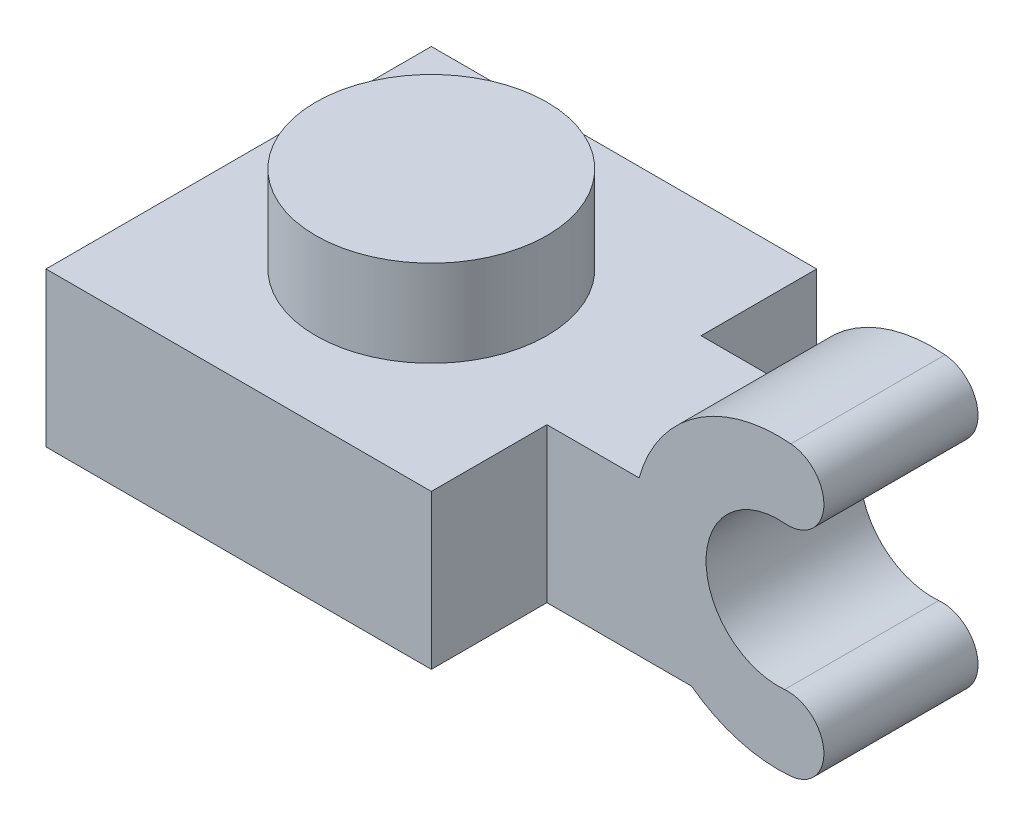
ISO-10303-21;
HEADER;
FILE_DESCRIPTION(('STEP AP214'),'2;1');
FILE_NAME('part.step','',(''),(''),'','','');
FILE_SCHEMA(('AUTOMOTIVE_DESIGN { 1 0 10303 214 1 1 1 1 }'));
ENDSEC;
DATA;
#1=APPLICATION_CONTEXT('core data for automotive mechanical design processes');
#2=APPLICATION_PROTOCOL_DEFINITION('international standard','automotive_design',2000,#1);
#3=PRODUCT_CONTEXT('',#1,'mechanical');
#4=PRODUCT('Part','Part','',(#3));
#5=PRODUCT_RELATED_PRODUCT_CATEGORY('part','',(#4));
#6=PRODUCT_DEFINITION_FORMATION('','',#4);
#7=PRODUCT_DEFINITION_CONTEXT('part definition',#1,'design');
#8=PRODUCT_DEFINITION('design','',#6,#7);
#9=PRODUCT_DEFINITION_SHAPE('','',#8);
#10=(LENGTH_UNIT() NAMED_UNIT(*) SI_UNIT(.MILLI.,.METRE.));
#11=(NAMED_UNIT(*) PLANE_ANGLE_UNIT() SI_UNIT($,.RADIAN.));
#12=(NAMED_UNIT(*) SI_UNIT($,.STERADIAN.) SOLID_ANGLE_UNIT());
#13=UNCERTAINTY_MEASURE_WITH_UNIT(LENGTH_MEASURE(1.E-05),#10,'distance_accuracy_value','');
#14=(GEOMETRIC_REPRESENTATION_CONTEXT(3) GLOBAL_UNCERTAINTY_ASSIGNED_CONTEXT((#13)) GLOBAL_UNIT_ASSIGNED_CONTEXT((#10,
#11,#12)) REPRESENTATION_CONTEXT('',''));
#15=CARTESIAN_POINT('',(0.,0.,0.));
#16=DIRECTION('',(0.,0.,1.));
#17=DIRECTION('',(1.,0.,0.));
#18=AXIS2_PLACEMENT_3D('',#15,#16,#17);
#19=CARTESIAN_POINT('',(8.,3.2,0.));
#20=DIRECTION('',(-1.,0.,0.));
#21=DIRECTION('',(0.,0.,1.));
#22=AXIS2_PLACEMENT_3D('',#19,#20,#21);
#23=PLANE('',#22);
#24=DIRECTION('',(0.,1.,0.));
#25=VECTOR('',#24,1.);
#26=CARTESIAN_POINT('',(8.,3.2,-5.6));
#27=LINE('',#26,#25);
#28=CARTESIAN_POINT('',(8.,0.,-5.6));
#29=VERTEX_POINT('',#28);
#30=CARTESIAN_POINT('',(8.,3.2,-5.6));
#31=VERTEX_POINT('',#30);
#32=EDGE_CURVE('E198',#29,#31,#27,.T.);
#33=ORIENTED_EDGE('',*,*,#32,.F.);
#34=DIRECTION('',(0.,0.,-1.));
#35=VECTOR('',#34,1.);
#36=CARTESIAN_POINT('',(8.,0.,0.));
#37=LINE('',#36,#35);
#38=CARTESIAN_POINT('',(8.,0.,-8.));
#39=VERTEX_POINT('',#38);
#40=EDGE_CURVE('E315',#29,#39,#37,.T.);
#41=ORIENTED_EDGE('',*,*,#40,.T.);
#42=DIRECTION('',(0.,-1.,0.));
#43=VECTOR('',#42,1.);
#44=CARTESIAN_POINT('',(8.,3.2,-8.));
#45=LINE('',#44,#43);
#46=CARTESIAN_POINT('',(8.,3.2,-8.));
#47=VERTEX_POINT('',#46);
#48=EDGE_CURVE('E325',#47,#39,#45,.T.);
#49=ORIENTED_EDGE('',*,*,#48,.F.);
#50=DIRECTION('',(0.,0.,-1.));
#51=VECTOR('',#50,1.);
#52=CARTESIAN_POINT('',(8.,3.2,0.));
#53=LINE('',#52,#51);
#54=EDGE_CURVE('E300',#31,#47,#53,.T.);
#55=ORIENTED_EDGE('',*,*,#54,.F.);
#56=EDGE_LOOP('',(#33,#41,#49,#55));
#57=FACE_BOUND('',#56,.T.);
#58=ADVANCED_FACE('F42',(#57),#23,.F.);
#59=CARTESIAN_POINT('',(0.,3.2,0.));
#60=DIRECTION('',(1.,0.,0.));
#61=DIRECTION('',(0.,0.,-1.));
#62=AXIS2_PLACEMENT_3D('',#59,#60,#61);
#63=PLANE('',#62);
#64=DIRECTION('',(0.,0.,1.));
#65=VECTOR('',#64,1.);
#66=CARTESIAN_POINT('',(0.,0.,0.));
#67=LINE('',#66,#65);
#68=CARTESIAN_POINT('',(0.,0.,-8.));
#69=VERTEX_POINT('',#68);
#70=CARTESIAN_POINT('',(0.,0.,0.));
#71=VERTEX_POINT('',#70);
#72=EDGE_CURVE('E290',#69,#71,#67,.T.);
#73=ORIENTED_EDGE('',*,*,#72,.T.);
#74=DIRECTION('',(0.,-1.,0.));
#75=VECTOR('',#74,1.);
#76=CARTESIAN_POINT('',(0.,3.2,0.));
#77=LINE('',#76,#75);
#78=CARTESIAN_POINT('',(0.,3.2,0.));
#79=VERTEX_POINT('',#78);
#80=EDGE_CURVE('E46',#79,#71,#77,.T.);
#81=ORIENTED_EDGE('',*,*,#80,.F.);
#82=DIRECTION('',(0.,0.,1.));
#83=VECTOR('',#82,1.);
#84=CARTESIAN_POINT('',(0.,3.2,0.));
#85=LINE('',#84,#83);
#86=CARTESIAN_POINT('',(0.,3.2,-8.));
#87=VERTEX_POINT('',#86);
#88=EDGE_CURVE('E292',#87,#79,#85,.T.);
#89=ORIENTED_EDGE('',*,*,#88,.F.);
#90=DIRECTION('',(0.,-1.,0.));
#91=VECTOR('',#90,1.);
#92=CARTESIAN_POINT('',(0.,3.2,-8.));
#93=LINE('',#92,#91);
#94=EDGE_CURVE('E308',#87,#69,#93,.T.);
#95=ORIENTED_EDGE('',*,*,#94,.T.);
#96=EDGE_LOOP('',(#73,#81,#89,#95));
#97=FACE_BOUND('',#96,.T.);
#98=ADVANCED_FACE('F44',(#97),#63,.F.);
#99=CARTESIAN_POINT('',(0.,3.2,0.));
#100=DIRECTION('',(0.,0.,-1.));
#101=DIRECTION('',(-1.,0.,0.));
#102=AXIS2_PLACEMENT_3D('',#99,#100,#101);
#103=PLANE('',#102);
#104=DIRECTION('',(1.,0.,0.));
#105=VECTOR('',#104,1.);
#106=CARTESIAN_POINT('',(0.,0.,0.));
#107=LINE('',#106,#105);
#108=CARTESIAN_POINT('',(8.,0.,0.));
#109=VERTEX_POINT('',#108);
#110=EDGE_CURVE('E312',#71,#109,#107,.T.);
#111=ORIENTED_EDGE('',*,*,#110,.T.);
#112=DIRECTION('',(0.,-1.,0.));
#113=VECTOR('',#112,1.);
#114=CARTESIAN_POINT('',(8.,3.2,0.));
#115=LINE('',#114,#113);
#116=CARTESIAN_POINT('',(8.,3.2,0.));
#117=VERTEX_POINT('',#116);
#118=EDGE_CURVE('E328',#117,#109,#115,.T.);
#119=ORIENTED_EDGE('',*,*,#118,.F.);
#120=DIRECTION('',(1.,0.,0.));
#121=VECTOR('',#120,1.);
#122=CARTESIAN_POINT('',(0.,3.2,0.));
#123=LINE('',#122,#121);
#124=EDGE_CURVE('E296',#79,#117,#123,.T.);
#125=ORIENTED_EDGE('',*,*,#124,.F.);
#126=ORIENTED_EDGE('',*,*,#80,.T.);
#127=EDGE_LOOP('',(#111,#119,#125,#126));
#128=FACE_BOUND('',#127,.T.);
#129=ADVANCED_FACE('F339',(#128),#103,.F.);
#130=CARTESIAN_POINT('',(8.,0.,-2.4));
#131=VERTEX_POINT('',#130);
#132=EDGE_CURVE('E316',#109,#131,#37,.T.);
#133=ORIENTED_EDGE('',*,*,#132,.T.);
#134=DIRECTION('',(0.,1.,0.));
#135=VECTOR('',#134,1.);
#136=CARTESIAN_POINT('',(8.,3.2,-2.4));
#137=LINE('',#136,#135);
#138=CARTESIAN_POINT('',(8.,3.2,-2.4));
#139=VERTEX_POINT('',#138);
#140=EDGE_CURVE('E223',#131,#139,#137,.T.);
#141=ORIENTED_EDGE('',*,*,#140,.T.);
#142=EDGE_CURVE('E301',#117,#139,#53,.T.);
#143=ORIENTED_EDGE('',*,*,#142,.F.);
#144=ORIENTED_EDGE('',*,*,#118,.T.);
#145=EDGE_LOOP('',(#133,#141,#143,#144));
#146=FACE_BOUND('',#145,.T.);
#147=ADVANCED_FACE('F349',(#146),#23,.F.);
#148=CARTESIAN_POINT('',(0.,3.2,-8.));
#149=DIRECTION('',(0.,0.,1.));
#150=DIRECTION('',(1.,0.,0.));
#151=AXIS2_PLACEMENT_3D('',#148,#149,#150);
#152=PLANE('',#151);
#153=DIRECTION('',(-1.,0.,0.));
#154=VECTOR('',#153,1.);
#155=CARTESIAN_POINT('',(0.,0.,-8.));
#156=LINE('',#155,#154);
#157=EDGE_CURVE('E297',#39,#69,#156,.T.);
#158=ORIENTED_EDGE('',*,*,#157,.T.);
#159=ORIENTED_EDGE('',*,*,#94,.F.);
#160=DIRECTION('',(-1.,0.,0.));
#161=VECTOR('',#160,1.);
#162=CARTESIAN_POINT('',(0.,3.2,-8.));
#163=LINE('',#162,#161);
#164=EDGE_CURVE('E305',#47,#87,#163,.T.);
#165=ORIENTED_EDGE('',*,*,#164,.F.);
#166=ORIENTED_EDGE('',*,*,#48,.T.);
#167=EDGE_LOOP('',(#158,#159,#165,#166));
#168=FACE_BOUND('',#167,.T.);
#169=ADVANCED_FACE('F357',(#168),#152,.F.);
#170=CARTESIAN_POINT('',(0.,3.2,0.));
#171=DIRECTION('',(0.,-1.,0.));
#172=DIRECTION('',(0.,0.,-1.));
#173=AXIS2_PLACEMENT_3D('',#170,#171,#172);
#174=PLANE('',#173);
#175=CARTESIAN_POINT('',(4.,3.2,-4.));
#176=DIRECTION('',(0.,1.,0.));
#177=DIRECTION('',(0.,0.,1.));
#178=AXIS2_PLACEMENT_3D('',#175,#176,#177);
#179=CIRCLE('',#178,2.4);
#180=CARTESIAN_POINT('',(4.,3.2,-1.6));
#181=VERTEX_POINT('',#180);
#182=EDGE_CURVE('E11',#181,#181,#179,.T.);
#183=ORIENTED_EDGE('',*,*,#182,.F.);
#184=EDGE_LOOP('',(#183));
#185=FACE_BOUND('',#184,.T.);
#186=ORIENTED_EDGE('',*,*,#88,.T.);
#187=ORIENTED_EDGE('',*,*,#124,.T.);
#188=ORIENTED_EDGE('',*,*,#142,.T.);
#189=DIRECTION('',(1.,0.,0.));
#190=VECTOR('',#189,1.);
#191=CARTESIAN_POINT('',(8.,3.2,-2.4));
#192=LINE('',#191,#190);
#193=CARTESIAN_POINT('',(9.91253311985758,3.2,-2.4));
#194=VERTEX_POINT('',#193);
#195=EDGE_CURVE('E59',#139,#194,#192,.T.);
#196=ORIENTED_EDGE('',*,*,#195,.T.);
#197=DIRECTION('',(0.,0.,-1.));
#198=VECTOR('',#197,1.);
#199=CARTESIAN_POINT('',(9.91253311985758,3.2,-2.4));
#200=LINE('',#199,#198);
#201=CARTESIAN_POINT('',(9.91253311985758,3.2,-5.6));
#202=VERTEX_POINT('',#201);
#203=EDGE_CURVE('E234',#194,#202,#200,.T.);
#204=ORIENTED_EDGE('',*,*,#203,.T.);
#205=DIRECTION('',(1.,0.,0.));
#206=VECTOR('',#205,1.);
#207=CARTESIAN_POINT('',(8.,3.2,-5.6));
#208=LINE('',#207,#206);
#209=EDGE_CURVE('E201',#31,#202,#208,.T.);
#210=ORIENTED_EDGE('',*,*,#209,.F.);
#211=ORIENTED_EDGE('',*,*,#54,.T.);
#212=ORIENTED_EDGE('',*,*,#164,.T.);
#213=EDGE_LOOP('',(#186,#187,#188,#196,#204,#210,#211,#212));
#214=FACE_BOUND('',#213,.T.);
#215=ADVANCED_FACE('F351',(#185,#214),#174,.F.);
#216=CARTESIAN_POINT('',(0.,0.,0.));
#217=DIRECTION('',(0.,-1.,0.));
#218=DIRECTION('',(0.,0.,-1.));
#219=AXIS2_PLACEMENT_3D('',#216,#217,#218);
#220=PLANE('',#219);
#221=DIRECTION('',(0.,0.,-1.));
#222=VECTOR('',#221,1.);
#223=CARTESIAN_POINT('',(1.6,0.,-1.6));
#224=LINE('',#223,#222);
#225=CARTESIAN_POINT('',(1.6,0.,-1.6));
#226=VERTEX_POINT('',#225);
#227=CARTESIAN_POINT('',(1.6,0.,-6.4));
#228=VERTEX_POINT('',#227);
#229=EDGE_CURVE('E67',#226,#228,#224,.T.);
#230=ORIENTED_EDGE('',*,*,#229,.F.);
#231=DIRECTION('',(-1.,0.,0.));
#232=VECTOR('',#231,1.);
#233=CARTESIAN_POINT('',(1.6,0.,-1.6));
#234=LINE('',#233,#232);
#235=CARTESIAN_POINT('',(6.4,0.,-1.6));
#236=VERTEX_POINT('',#235);
#237=EDGE_CURVE('E250',#236,#226,#234,.T.);
#238=ORIENTED_EDGE('',*,*,#237,.F.);
#239=DIRECTION('',(0.,0.,1.));
#240=VECTOR('',#239,1.);
#241=CARTESIAN_POINT('',(6.4,0.,-1.6));
#242=LINE('',#241,#240);
#243=CARTESIAN_POINT('',(6.4,0.,-6.4));
#244=VERTEX_POINT('',#243);
#245=EDGE_CURVE('E269',#244,#236,#242,.T.);
#246=ORIENTED_EDGE('',*,*,#245,.F.);
#247=DIRECTION('',(1.,0.,0.));
#248=VECTOR('',#247,1.);
#249=CARTESIAN_POINT('',(1.6,0.,-6.4));
#250=LINE('',#249,#248);
#251=EDGE_CURVE('E265',#228,#244,#250,.T.);
#252=ORIENTED_EDGE('',*,*,#251,.F.);
#253=EDGE_LOOP('',(#230,#238,#246,#252));
#254=FACE_BOUND('',#253,.T.);
#255=ORIENTED_EDGE('',*,*,#72,.F.);
#256=ORIENTED_EDGE('',*,*,#157,.F.);
#257=ORIENTED_EDGE('',*,*,#40,.F.);
#258=DIRECTION('',(-1.,0.,0.));
#259=VECTOR('',#258,1.);
#260=CARTESIAN_POINT('',(8.,0.,-5.6));
#261=LINE('',#260,#259);
#262=CARTESIAN_POINT('',(11.0038995788178,0.,-5.6));
#263=VERTEX_POINT('',#262);
#264=EDGE_CURVE('E195',#263,#29,#261,.T.);
#265=ORIENTED_EDGE('',*,*,#264,.F.);
#266=DIRECTION('',(0.,0.,-1.));
#267=VECTOR('',#266,1.);
#268=CARTESIAN_POINT('',(11.0038995788178,0.,-2.4));
#269=LINE('',#268,#267);
#270=CARTESIAN_POINT('',(11.0038995788178,0.,-2.4));
#271=VERTEX_POINT('',#270);
#272=EDGE_CURVE('E237',#271,#263,#269,.T.);
#273=ORIENTED_EDGE('',*,*,#272,.F.);
#274=DIRECTION('',(-1.,0.,0.));
#275=VECTOR('',#274,1.);
#276=CARTESIAN_POINT('',(8.,0.,-2.4));
#277=LINE('',#276,#275);
#278=EDGE_CURVE('E219',#271,#131,#277,.T.);
#279=ORIENTED_EDGE('',*,*,#278,.T.);
#280=ORIENTED_EDGE('',*,*,#132,.F.);
#281=ORIENTED_EDGE('',*,*,#110,.F.);
#282=EDGE_LOOP('',(#255,#256,#257,#265,#273,#279,#280,#281));
#283=FACE_BOUND('',#282,.T.);
#284=ADVANCED_FACE('F346',(#254,#283),#220,.T.);
#285=CARTESIAN_POINT('',(4.,5.,-4.));
#286=DIRECTION('',(0.,-1.,0.));
#287=DIRECTION('',(0.,0.,-1.));
#288=AXIS2_PLACEMENT_3D('',#285,#286,#287);
#289=CYLINDRICAL_SURFACE('',#288,2.4);
#290=CARTESIAN_POINT('',(4.,5.,-4.));
#291=DIRECTION('',(0.,1.,0.));
#292=DIRECTION('',(0.,0.,1.));
#293=AXIS2_PLACEMENT_3D('',#290,#291,#292);
#294=CIRCLE('',#293,2.4);
#295=CARTESIAN_POINT('',(4.,5.,-1.6));
#296=VERTEX_POINT('',#295);
#297=EDGE_CURVE('E279',#296,#296,#294,.T.);
#298=ORIENTED_EDGE('',*,*,#297,.F.);
#299=EDGE_LOOP('',(#298));
#300=FACE_BOUND('',#299,.T.);
#301=ORIENTED_EDGE('',*,*,#182,.T.);
#302=EDGE_LOOP('',(#301));
#303=FACE_BOUND('',#302,.T.);
#304=ADVANCED_FACE('F441',(#300,#303),#289,.T.);
#305=CARTESIAN_POINT('',(4.,5.,-4.));
#306=DIRECTION('',(0.,1.,0.));
#307=DIRECTION('',(0.,0.,1.));
#308=AXIS2_PLACEMENT_3D('',#305,#306,#307);
#309=PLANE('',#308);
#310=ORIENTED_EDGE('',*,*,#297,.T.);
#311=EDGE_LOOP('',(#310));
#312=FACE_BOUND('',#311,.T.);
#313=ADVANCED_FACE('F454',(#312),#309,.T.);
#314=CARTESIAN_POINT('',(1.6,1.8,-1.6));
#315=DIRECTION('',(-1.,0.,0.));
#316=DIRECTION('',(0.,0.,1.));
#317=AXIS2_PLACEMENT_3D('',#314,#315,#316);
#318=PLANE('',#317);
#319=ORIENTED_EDGE('',*,*,#229,.T.);
#320=DIRECTION('',(0.,-1.,0.));
#321=VECTOR('',#320,1.);
#322=CARTESIAN_POINT('',(1.6,1.8,-6.4));
#323=LINE('',#322,#321);
#324=CARTESIAN_POINT('',(1.6,1.8,-6.4));
#325=VERTEX_POINT('',#324);
#326=EDGE_CURVE('E262',#325,#228,#323,.T.);
#327=ORIENTED_EDGE('',*,*,#326,.F.);
#328=DIRECTION('',(0.,0.,-1.));
#329=VECTOR('',#328,1.);
#330=CARTESIAN_POINT('',(1.6,1.8,-1.6));
#331=LINE('',#330,#329);
#332=CARTESIAN_POINT('',(1.6,1.8,-1.6));
#333=VERTEX_POINT('',#332);
#334=EDGE_CURVE('E245',#333,#325,#331,.T.);
#335=ORIENTED_EDGE('',*,*,#334,.F.);
#336=DIRECTION('',(0.,-1.,0.));
#337=VECTOR('',#336,1.);
#338=CARTESIAN_POINT('',(1.6,1.8,-1.6));
#339=LINE('',#338,#337);
#340=EDGE_CURVE('E276',#333,#226,#339,.T.);
#341=ORIENTED_EDGE('',*,*,#340,.T.);
#342=EDGE_LOOP('',(#319,#327,#335,#341));
#343=FACE_BOUND('',#342,.T.);
#344=ADVANCED_FACE('F465',(#343),#318,.F.);
#345=CARTESIAN_POINT('',(1.6,1.8,-1.6));
#346=DIRECTION('',(0.,0.,1.));
#347=DIRECTION('',(1.,0.,0.));
#348=AXIS2_PLACEMENT_3D('',#345,#346,#347);
#349=PLANE('',#348);
#350=ORIENTED_EDGE('',*,*,#237,.T.);
#351=ORIENTED_EDGE('',*,*,#340,.F.);
#352=DIRECTION('',(-1.,0.,0.));
#353=VECTOR('',#352,1.);
#354=CARTESIAN_POINT('',(1.6,1.8,-1.6));
#355=LINE('',#354,#353);
#356=CARTESIAN_POINT('',(6.4,1.8,-1.6));
#357=VERTEX_POINT('',#356);
#358=EDGE_CURVE('E258',#357,#333,#355,.T.);
#359=ORIENTED_EDGE('',*,*,#358,.F.);
#360=DIRECTION('',(0.,-1.,0.));
#361=VECTOR('',#360,1.);
#362=CARTESIAN_POINT('',(6.4,1.8,-1.6));
#363=LINE('',#362,#361);
#364=EDGE_CURVE('E280',#357,#236,#363,.T.);
#365=ORIENTED_EDGE('',*,*,#364,.T.);
#366=EDGE_LOOP('',(#350,#351,#359,#365));
#367=FACE_BOUND('',#366,.T.);
#368=ADVANCED_FACE('F476',(#367),#349,.F.);
#369=CARTESIAN_POINT('',(6.4,1.8,-1.6));
#370=DIRECTION('',(1.,0.,0.));
#371=DIRECTION('',(0.,0.,-1.));
#372=AXIS2_PLACEMENT_3D('',#369,#370,#371);
#373=PLANE('',#372);
#374=ORIENTED_EDGE('',*,*,#245,.T.);
#375=ORIENTED_EDGE('',*,*,#364,.F.);
#376=DIRECTION('',(0.,0.,1.));
#377=VECTOR('',#376,1.);
#378=CARTESIAN_POINT('',(6.4,1.8,-1.6));
#379=LINE('',#378,#377);
#380=CARTESIAN_POINT('',(6.4,1.8,-6.4));
#381=VERTEX_POINT('',#380);
#382=EDGE_CURVE('E254',#381,#357,#379,.T.);
#383=ORIENTED_EDGE('',*,*,#382,.F.);
#384=DIRECTION('',(0.,-1.,0.));
#385=VECTOR('',#384,1.);
#386=CARTESIAN_POINT('',(6.4,1.8,-6.4));
#387=LINE('',#386,#385);
#388=EDGE_CURVE('E283',#381,#244,#387,.T.);
#389=ORIENTED_EDGE('',*,*,#388,.T.);
#390=EDGE_LOOP('',(#374,#375,#383,#389));
#391=FACE_BOUND('',#390,.T.);
#392=ADVANCED_FACE('F486',(#391),#373,.F.);
#393=CARTESIAN_POINT('',(1.6,1.8,-6.4));
#394=DIRECTION('',(0.,0.,-1.));
#395=DIRECTION('',(-1.,0.,0.));
#396=AXIS2_PLACEMENT_3D('',#393,#394,#395);
#397=PLANE('',#396);
#398=ORIENTED_EDGE('',*,*,#251,.T.);
#399=ORIENTED_EDGE('',*,*,#388,.F.);
#400=DIRECTION('',(1.,0.,0.));
#401=VECTOR('',#400,1.);
#402=CARTESIAN_POINT('',(1.6,1.8,-6.4));
#403=LINE('',#402,#401);
#404=EDGE_CURVE('E249',#325,#381,#403,.T.);
#405=ORIENTED_EDGE('',*,*,#404,.F.);
#406=ORIENTED_EDGE('',*,*,#326,.T.);
#407=EDGE_LOOP('',(#398,#399,#405,#406));
#408=FACE_BOUND('',#407,.T.);
#409=ADVANCED_FACE('F497',(#408),#397,.F.);
#410=CARTESIAN_POINT('',(0.,1.8,0.));
#411=DIRECTION('',(0.,-1.,0.));
#412=DIRECTION('',(0.,0.,-1.));
#413=AXIS2_PLACEMENT_3D('',#410,#411,#412);
#414=PLANE('',#413);
#415=ORIENTED_EDGE('',*,*,#334,.T.);
#416=ORIENTED_EDGE('',*,*,#404,.T.);
#417=ORIENTED_EDGE('',*,*,#382,.T.);
#418=ORIENTED_EDGE('',*,*,#358,.T.);
#419=EDGE_LOOP('',(#415,#416,#417,#418));
#420=FACE_BOUND('',#419,.T.);
#421=ADVANCED_FACE('F508',(#420),#414,.T.);
#422=CARTESIAN_POINT('',(13.,4.64143807070643,-2.4));
#423=DIRECTION('',(0.,0.,-1.));
#424=DIRECTION('',(-1.,0.,0.));
#425=AXIS2_PLACEMENT_3D('',#422,#423,#424);
#426=CYLINDRICAL_SURFACE('',#425,0.750000000000001);
#427=DIRECTION('',(0.,0.,-1.));
#428=VECTOR('',#427,1.);
#429=CARTESIAN_POINT('',(12.9346331929393,3.89429204713762,-2.4));
#430=LINE('',#429,#428);
#431=CARTESIAN_POINT('',(12.9346331929393,3.89429204713762,-2.4));
#432=VERTEX_POINT('',#431);
#433=CARTESIAN_POINT('',(12.9346331929393,3.89429204713762,-5.6));
#434=VERTEX_POINT('',#433);
#435=EDGE_CURVE('E158',#432,#434,#430,.T.);
#436=ORIENTED_EDGE('',*,*,#435,.T.);
#437=CARTESIAN_POINT('',(13.,4.64143807070643,-5.6));
#438=DIRECTION('',(0.,0.,-1.));
#439=DIRECTION('',(-1.,0.,0.));
#440=AXIS2_PLACEMENT_3D('',#437,#438,#439);
#441=CIRCLE('',#440,0.750000000000001);
#442=CARTESIAN_POINT('',(13.0653668070608,5.38858409427524,-5.6));
#443=VERTEX_POINT('',#442);
#444=EDGE_CURVE('E162',#443,#434,#441,.T.);
#445=ORIENTED_EDGE('',*,*,#444,.F.);
#446=DIRECTION('',(0.,0.,-1.));
#447=VECTOR('',#446,1.);
#448=CARTESIAN_POINT('',(13.0653668070608,5.38858409427524,-2.4));
#449=LINE('',#448,#447);
#450=CARTESIAN_POINT('',(13.0653668070608,5.38858409427524,-2.4));
#451=VERTEX_POINT('',#450);
#452=EDGE_CURVE('E231',#451,#443,#449,.T.);
#453=ORIENTED_EDGE('',*,*,#452,.F.);
#454=CARTESIAN_POINT('',(13.,4.64143807070643,-2.4));
#455=DIRECTION('',(0.,0.,-1.));
#456=DIRECTION('',(-1.,0.,0.));
#457=AXIS2_PLACEMENT_3D('',#454,#455,#456);
#458=CIRCLE('',#457,0.750000000000001);
#459=EDGE_CURVE('E164',#451,#432,#458,.T.);
#460=ORIENTED_EDGE('',*,*,#459,.T.);
#461=EDGE_LOOP('',(#436,#445,#453,#460));
#462=FACE_BOUND('',#461,.T.);
#463=ADVANCED_FACE('F160',(#462),#426,.T.);
#464=CARTESIAN_POINT('',(12.8038995788178,2.4,-2.4));
#465=DIRECTION('',(0.,0.,-1.));
#466=DIRECTION('',(-1.,0.,0.));
#467=AXIS2_PLACEMENT_3D('',#464,#465,#466);
#468=CYLINDRICAL_SURFACE('',#467,3.);
#469=ORIENTED_EDGE('',*,*,#452,.T.);
#470=CARTESIAN_POINT('',(12.8038995788178,2.4,-5.6));
#471=DIRECTION('',(0.,0.,-1.));
#472=DIRECTION('',(-1.,0.,0.));
#473=AXIS2_PLACEMENT_3D('',#470,#471,#472);
#474=CIRCLE('',#473,3.);
#475=EDGE_CURVE('E185',#202,#443,#474,.T.);
#476=ORIENTED_EDGE('',*,*,#475,.F.);
#477=ORIENTED_EDGE('',*,*,#203,.F.);
#478=CARTESIAN_POINT('',(12.8038995788178,2.4,-2.4));
#479=DIRECTION('',(0.,0.,-1.));
#480=DIRECTION('',(-1.,0.,0.));
#481=AXIS2_PLACEMENT_3D('',#478,#479,#480);
#482=CIRCLE('',#481,3.);
#483=EDGE_CURVE('E170',#194,#451,#482,.T.);
#484=ORIENTED_EDGE('',*,*,#483,.T.);
#485=EDGE_LOOP('',(#469,#476,#477,#484));
#486=FACE_BOUND('',#485,.T.);
#487=ADVANCED_FACE('F378',(#486),#468,.T.);
#488=CARTESIAN_POINT('',(12.8038995788178,2.4,-2.4));
#489=DIRECTION('',(0.,0.,-1.));
#490=DIRECTION('',(-1.,0.,0.));
#491=AXIS2_PLACEMENT_3D('',#488,#489,#490);
#492=CYLINDRICAL_SURFACE('',#491,3.);
#493=ORIENTED_EDGE('',*,*,#272,.T.);
#494=CARTESIAN_POINT('',(12.8038995788178,2.4,-5.6));
#495=DIRECTION('',(0.,0.,-1.));
#496=DIRECTION('',(-1.,0.,0.));
#497=AXIS2_PLACEMENT_3D('',#494,#495,#496);
#498=CIRCLE('',#497,3.);
#499=CARTESIAN_POINT('',(13.0653668070607,-0.588584094275238,-5.6));
#500=VERTEX_POINT('',#499);
#501=EDGE_CURVE('E191',#500,#263,#498,.T.);
#502=ORIENTED_EDGE('',*,*,#501,.F.);
#503=DIRECTION('',(0.,0.,-1.));
#504=VECTOR('',#503,1.);
#505=CARTESIAN_POINT('',(13.0653668070607,-0.588584094275238,-2.4));
#506=LINE('',#505,#504);
#507=CARTESIAN_POINT('',(13.0653668070607,-0.588584094275238,-2.4));
#508=VERTEX_POINT('',#507);
#509=EDGE_CURVE('E240',#508,#500,#506,.T.);
#510=ORIENTED_EDGE('',*,*,#509,.F.);
#511=CARTESIAN_POINT('',(12.8038995788178,2.4,-2.4));
#512=DIRECTION('',(0.,0.,-1.));
#513=DIRECTION('',(-1.,0.,0.));
#514=AXIS2_PLACEMENT_3D('',#511,#512,#513);
#515=CIRCLE('',#514,3.);
#516=EDGE_CURVE('E215',#508,#271,#515,.T.);
#517=ORIENTED_EDGE('',*,*,#516,.T.);
#518=EDGE_LOOP('',(#493,#502,#510,#517));
#519=FACE_BOUND('',#518,.T.);
#520=ADVANCED_FACE('F365',(#519),#492,.T.);
#521=CARTESIAN_POINT('',(13.,0.158561929293571,-2.4));
#522=DIRECTION('',(0.,0.,-1.));
#523=DIRECTION('',(-1.,0.,0.));
#524=AXIS2_PLACEMENT_3D('',#521,#522,#523);
#525=CYLINDRICAL_SURFACE('',#524,0.75);
#526=ORIENTED_EDGE('',*,*,#509,.T.);
#527=CARTESIAN_POINT('',(13.,0.158561929293571,-5.6));
#528=DIRECTION('',(0.,0.,-1.));
#529=DIRECTION('',(-1.,0.,0.));
#530=AXIS2_PLACEMENT_3D('',#527,#528,#529);
#531=CIRCLE('',#530,0.75);
#532=CARTESIAN_POINT('',(12.9346331929393,0.905707952862381,-5.6));
#533=VERTEX_POINT('',#532);
#534=EDGE_CURVE('E179',#533,#500,#531,.T.);
#535=ORIENTED_EDGE('',*,*,#534,.F.);
#536=DIRECTION('',(0.,0.,-1.));
#537=VECTOR('',#536,1.);
#538=CARTESIAN_POINT('',(12.9346331929393,0.905707952862381,-2.4));
#539=LINE('',#538,#537);
#540=CARTESIAN_POINT('',(12.9346331929393,0.905707952862381,-2.4));
#541=VERTEX_POINT('',#540);
#542=EDGE_CURVE('E169',#541,#533,#539,.T.);
#543=ORIENTED_EDGE('',*,*,#542,.F.);
#544=CARTESIAN_POINT('',(13.,0.158561929293571,-2.4));
#545=DIRECTION('',(0.,0.,-1.));
#546=DIRECTION('',(-1.,0.,0.));
#547=AXIS2_PLACEMENT_3D('',#544,#545,#546);
#548=CIRCLE('',#547,0.75);
#549=EDGE_CURVE('E211',#541,#508,#548,.T.);
#550=ORIENTED_EDGE('',*,*,#549,.T.);
#551=EDGE_LOOP('',(#526,#535,#543,#550));
#552=FACE_BOUND('',#551,.T.);
#553=ADVANCED_FACE('F370',(#552),#525,.T.);
#554=CARTESIAN_POINT('',(12.8038995788178,2.4,-2.4));
#555=DIRECTION('',(0.,0.,-1.));
#556=DIRECTION('',(-1.,0.,0.));
#557=AXIS2_PLACEMENT_3D('',#554,#555,#556);
#558=CYLINDRICAL_SURFACE('',#557,1.5);
#559=ORIENTED_EDGE('',*,*,#542,.T.);
#560=CARTESIAN_POINT('',(12.8038995788178,2.4,-5.6));
#561=DIRECTION('',(0.,0.,1.));
#562=DIRECTION('',(-1.,0.,0.));
#563=AXIS2_PLACEMENT_3D('',#560,#561,#562);
#564=CIRCLE('',#563,1.5);
#565=EDGE_CURVE('E173',#434,#533,#564,.T.);
#566=ORIENTED_EDGE('',*,*,#565,.F.);
#567=ORIENTED_EDGE('',*,*,#435,.F.);
#568=CARTESIAN_POINT('',(12.8038995788178,2.4,-2.4));
#569=DIRECTION('',(0.,0.,1.));
#570=DIRECTION('',(-1.,0.,0.));
#571=AXIS2_PLACEMENT_3D('',#568,#569,#570);
#572=CIRCLE('',#571,1.5);
#573=EDGE_CURVE('E208',#432,#541,#572,.T.);
#574=ORIENTED_EDGE('',*,*,#573,.T.);
#575=EDGE_LOOP('',(#559,#566,#567,#574));
#576=FACE_BOUND('',#575,.T.);
#577=ADVANCED_FACE('F174',(#576),#558,.F.);
#578=CARTESIAN_POINT('',(13.,4.64143807070643,-2.4));
#579=DIRECTION('',(0.,0.,-1.));
#580=DIRECTION('',(-1.,0.,0.));
#581=AXIS2_PLACEMENT_3D('',#578,#579,#580);
#582=PLANE('',#581);
#583=ORIENTED_EDGE('',*,*,#459,.F.);
#584=ORIENTED_EDGE('',*,*,#483,.F.);
#585=ORIENTED_EDGE('',*,*,#195,.F.);
#586=ORIENTED_EDGE('',*,*,#140,.F.);
#587=ORIENTED_EDGE('',*,*,#278,.F.);
#588=ORIENTED_EDGE('',*,*,#516,.F.);
#589=ORIENTED_EDGE('',*,*,#549,.F.);
#590=ORIENTED_EDGE('',*,*,#573,.F.);
#591=EDGE_LOOP('',(#583,#584,#585,#586,#587,#588,#589,#590));
#592=FACE_BOUND('',#591,.T.);
#593=ADVANCED_FACE('F368',(#592),#582,.F.);
#594=CARTESIAN_POINT('',(13.,4.64143807070643,-5.6));
#595=DIRECTION('',(0.,0.,-1.));
#596=DIRECTION('',(-1.,0.,0.));
#597=AXIS2_PLACEMENT_3D('',#594,#595,#596);
#598=PLANE('',#597);
#599=ORIENTED_EDGE('',*,*,#444,.T.);
#600=ORIENTED_EDGE('',*,*,#565,.T.);
#601=ORIENTED_EDGE('',*,*,#534,.T.);
#602=ORIENTED_EDGE('',*,*,#501,.T.);
#603=ORIENTED_EDGE('',*,*,#264,.T.);
#604=ORIENTED_EDGE('',*,*,#32,.T.);
#605=ORIENTED_EDGE('',*,*,#209,.T.);
#606=ORIENTED_EDGE('',*,*,#475,.T.);
#607=EDGE_LOOP('',(#599,#600,#601,#602,#603,#604,#605,#606));
#608=FACE_BOUND('',#607,.T.);
#609=ADVANCED_FACE('F182',(#608),#598,.T.);
#610=CLOSED_SHELL('',(#58,#98,#129,#147,#169,#215,#284,#304,#313,#344,#368,#392,#409,#421,#463,
#487,#520,#553,#577,#593,#609));
#611=MANIFOLD_SOLID_BREP('B2',#610);
#612=ADVANCED_BREP_SHAPE_REPRESENTATION('',(#18,#611),#14);
#613=SHAPE_DEFINITION_REPRESENTATION(#9,#612);
ENDSEC;
END-ISO-10303-21;
